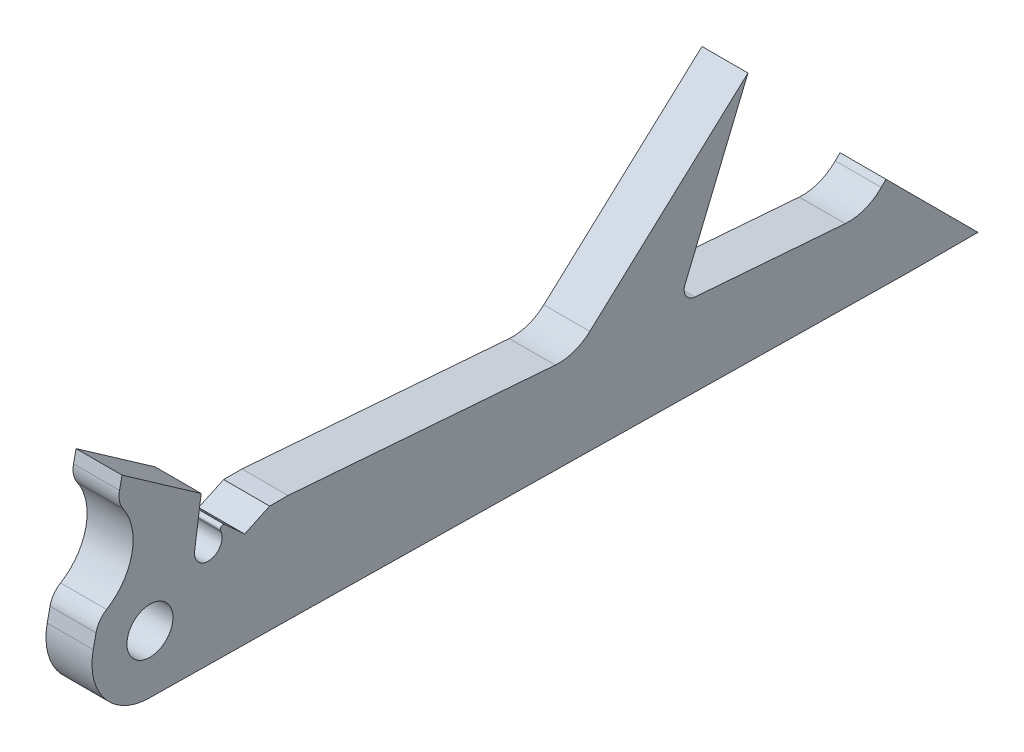
ISO-10303-21;
HEADER;
FILE_DESCRIPTION(('STEP AP214'),'2;1');
FILE_NAME('part.step','',(''),(''),'','','');
FILE_SCHEMA(('AUTOMOTIVE_DESIGN { 1 0 10303 214 1 1 1 1 }'));
ENDSEC;
DATA;
#1=APPLICATION_CONTEXT('core data for automotive mechanical design processes');
#2=APPLICATION_PROTOCOL_DEFINITION('international standard','automotive_design',2000,#1);
#3=PRODUCT_CONTEXT('',#1,'mechanical');
#4=PRODUCT('Part','Part','',(#3));
#5=PRODUCT_RELATED_PRODUCT_CATEGORY('part','',(#4));
#6=PRODUCT_DEFINITION_FORMATION('','',#4);
#7=PRODUCT_DEFINITION_CONTEXT('part definition',#1,'design');
#8=PRODUCT_DEFINITION('design','',#6,#7);
#9=PRODUCT_DEFINITION_SHAPE('','',#8);
#10=(LENGTH_UNIT() NAMED_UNIT(*) SI_UNIT(.MILLI.,.METRE.));
#11=(NAMED_UNIT(*) PLANE_ANGLE_UNIT() SI_UNIT($,.RADIAN.));
#12=(NAMED_UNIT(*) SI_UNIT($,.STERADIAN.) SOLID_ANGLE_UNIT());
#13=UNCERTAINTY_MEASURE_WITH_UNIT(LENGTH_MEASURE(1.E-05),#10,'distance_accuracy_value','');
#14=(GEOMETRIC_REPRESENTATION_CONTEXT(3) GLOBAL_UNCERTAINTY_ASSIGNED_CONTEXT((#13)) GLOBAL_UNIT_ASSIGNED_CONTEXT((#10,
#11,#12)) REPRESENTATION_CONTEXT('',''));
#15=CARTESIAN_POINT('',(0.,0.,0.));
#16=DIRECTION('',(0.,0.,1.));
#17=DIRECTION('',(1.,0.,0.));
#18=AXIS2_PLACEMENT_3D('',#15,#16,#17);
#19=CARTESIAN_POINT('',(-102.961958676435,16.1650258056597,-195.52164647412));
#20=DIRECTION('',(0.,0.997013615660703,-0.0772259683472603));
#21=DIRECTION('',(0.,0.0772259683472603,0.997013615660703));
#22=AXIS2_PLACEMENT_3D('',#19,#20,#21);
#23=PLANE('',#22);
#24=DIRECTION('',(0.,0.0772259683472603,0.997013615660703));
#25=VECTOR('',#24,1.);
#26=CARTESIAN_POINT('',(6.35,16.1650258056597,-195.52164647412));
#27=LINE('',#26,#25);
#28=CARTESIAN_POINT('',(6.35,13.3075235044553,-232.412976709976));
#29=VERTEX_POINT('',#28);
#30=CARTESIAN_POINT('',(6.35,16.1650258056597,-195.52164647412));
#31=VERTEX_POINT('',#30);
#32=EDGE_CURVE('E305',#29,#31,#27,.T.);
#33=ORIENTED_EDGE('',*,*,#32,.F.);
#34=DIRECTION('',(1.,0.,0.));
#35=VECTOR('',#34,1.);
#36=CARTESIAN_POINT('',(0.,13.3075235044553,-232.412976709976));
#37=LINE('',#36,#35);
#38=CARTESIAN_POINT('',(0.,13.3075235044553,-232.412976709976));
#39=VERTEX_POINT('',#38);
#40=EDGE_CURVE('E397',#29,#39,#37,.F.);
#41=ORIENTED_EDGE('',*,*,#40,.T.);
#42=DIRECTION('',(0.,-0.0772259683472603,-0.997013615660703));
#43=VECTOR('',#42,1.);
#44=CARTESIAN_POINT('',(0.,16.1650258056597,-195.52164647412));
#45=LINE('',#44,#43);
#46=CARTESIAN_POINT('',(0.,16.1650258056597,-195.52164647412));
#47=VERTEX_POINT('',#46);
#48=EDGE_CURVE('E250',#47,#39,#45,.T.);
#49=ORIENTED_EDGE('',*,*,#48,.F.);
#50=DIRECTION('',(-1.,0.,0.));
#51=VECTOR('',#50,1.);
#52=CARTESIAN_POINT('',(6.35,16.1650258056597,-195.52164647412));
#53=LINE('',#52,#51);
#54=EDGE_CURVE('E363',#31,#47,#53,.T.);
#55=ORIENTED_EDGE('',*,*,#54,.F.);
#56=EDGE_LOOP('',(#33,#41,#49,#55));
#57=FACE_BOUND('',#56,.T.);
#58=ADVANCED_FACE('F41',(#57),#23,.T.);
#59=CARTESIAN_POINT('',(6.35,11.1751250606039,-168.642656227328));
#60=DIRECTION('',(0.,-0.206239852593916,-0.9785014681655));
#61=DIRECTION('',(0.,0.9785014681655,-0.206239852593917));
#62=AXIS2_PLACEMENT_3D('',#59,#60,#61);
#63=PLANE('',#62);
#64=DIRECTION('',(-1.,0.,0.));
#65=VECTOR('',#64,1.);
#66=CARTESIAN_POINT('',(6.35,30.050618874137,-172.621065241919));
#67=LINE('',#66,#65);
#68=CARTESIAN_POINT('',(6.35,30.050618874137,-172.621065241919));
#69=VERTEX_POINT('',#68);
#70=CARTESIAN_POINT('',(0.,30.050618874137,-172.621065241919));
#71=VERTEX_POINT('',#70);
#72=EDGE_CURVE('E345',#69,#71,#67,.T.);
#73=ORIENTED_EDGE('',*,*,#72,.T.);
#74=DIRECTION('',(0.,-0.9785014681655,0.206239852593917));
#75=VECTOR('',#74,1.);
#76=CARTESIAN_POINT('',(0.,11.1751250606039,-168.642656227328));
#77=LINE('',#76,#75);
#78=CARTESIAN_POINT('',(0.,28.4075243340542,-172.274748361701));
#79=VERTEX_POINT('',#78);
#80=EDGE_CURVE('E282',#71,#79,#77,.T.);
#81=ORIENTED_EDGE('',*,*,#80,.T.);
#82=DIRECTION('',(1.,0.,0.));
#83=VECTOR('',#82,1.);
#84=CARTESIAN_POINT('',(6.35,28.4075243340542,-172.274748361701));
#85=LINE('',#84,#83);
#86=CARTESIAN_POINT('',(6.35,28.4075243340542,-172.274748361701));
#87=VERTEX_POINT('',#86);
#88=EDGE_CURVE('E391',#79,#87,#85,.T.);
#89=ORIENTED_EDGE('',*,*,#88,.T.);
#90=DIRECTION('',(0.,-0.9785014681655,0.206239852593916));
#91=VECTOR('',#90,1.);
#92=CARTESIAN_POINT('',(6.35,11.1751250606039,-168.642656227328));
#93=LINE('',#92,#91);
#94=EDGE_CURVE('E339',#69,#87,#93,.T.);
#95=ORIENTED_EDGE('',*,*,#94,.F.);
#96=EDGE_LOOP('',(#73,#81,#89,#95));
#97=FACE_BOUND('',#96,.T.);
#98=ADVANCED_FACE('F475',(#97),#63,.F.);
#99=CARTESIAN_POINT('',(6.35,9.525,-176.47164647412));
#100=DIRECTION('',(1.,0.,0.));
#101=DIRECTION('',(0.,0.,-1.));
#102=AXIS2_PLACEMENT_3D('',#99,#100,#101);
#103=PLANE('',#102);
#104=CARTESIAN_POINT('',(6.35,21.5738272107236,-166.529745054064));
#105=DIRECTION('',(1.,0.,0.));
#106=DIRECTION('',(0.,0.,-1.));
#107=AXIS2_PLACEMENT_3D('',#104,#105,#106);
#108=CIRCLE('',#107,7.61999999999998);
#109=CARTESIAN_POINT('',(6.35,15.0614131048564,-170.486114919698));
#110=VERTEX_POINT('',#109);
#111=CARTESIAN_POINT('',(6.35,25.9353935104965,-172.778035973402));
#112=VERTEX_POINT('',#111);
#113=EDGE_CURVE('E311',#110,#112,#108,.T.);
#114=ORIENTED_EDGE('',*,*,#113,.F.);
#115=CARTESIAN_POINT('',(6.34999999999999,12.3479072274118,-172.134602363713));
#116=DIRECTION('',(1.,0.,0.));
#117=DIRECTION('',(0.,0.,-1.));
#118=AXIS2_PLACEMENT_3D('',#115,#116,#117);
#119=CIRCLE('',#118,3.175);
#120=CARTESIAN_POINT('',(6.35,13.0027187593975,-169.027860202287));
#121=VERTEX_POINT('',#120);
#122=EDGE_CURVE('E389',#110,#121,#119,.T.);
#123=ORIENTED_EDGE('',*,*,#122,.T.);
#124=CARTESIAN_POINT('',(6.35,11.1751250606039,-168.642656227328));
#125=VERTEX_POINT('',#124);
#126=EDGE_CURVE('E338',#121,#125,#93,.T.);
#127=ORIENTED_EDGE('',*,*,#126,.T.);
#128=CARTESIAN_POINT('',(6.35,9.525,-176.47164647412));
#129=DIRECTION('',(1.,0.,0.));
#130=DIRECTION('',(0.,0.,-1.));
#131=AXIS2_PLACEMENT_3D('',#128,#129,#130);
#132=CIRCLE('',#131,8.00100000000005);
#133=CARTESIAN_POINT('',(6.35,1.52470715135464,-176.365272906379));
#134=VERTEX_POINT('',#133);
#135=EDGE_CURVE('E318',#125,#134,#132,.T.);
#136=ORIENTED_EDGE('',*,*,#135,.T.);
#137=DIRECTION('',(0.,-0.0132950340883751,-0.999911617128528));
#138=VECTOR('',#137,1.);
#139=CARTESIAN_POINT('',(6.35,1.27000000001228,-195.521646474134));
#140=LINE('',#139,#138);
#141=CARTESIAN_POINT('',(6.35,1.27000000001228,-195.521646474134));
#142=VERTEX_POINT('',#141);
#143=EDGE_CURVE('E321',#134,#142,#140,.T.);
#144=ORIENTED_EDGE('',*,*,#143,.T.);
#145=DIRECTION('',(0.,-0.0148131893139548,-0.999890278691792));
#146=VECTOR('',#145,1.);
#147=CARTESIAN_POINT('',(6.35,1.27000000001228,-195.521646474134));
#148=LINE('',#147,#146);
#149=CARTESIAN_POINT('',(6.35,1.22755538373154E-11,-281.24664647412));
#150=VERTEX_POINT('',#149);
#151=EDGE_CURVE('E297',#142,#150,#148,.T.);
#152=ORIENTED_EDGE('',*,*,#151,.T.);
#153=DIRECTION('',(0.,0.,-1.));
#154=VECTOR('',#153,1.);
#155=CARTESIAN_POINT('',(6.35,1.22755538373154E-11,-281.24664647412));
#156=LINE('',#155,#154);
#157=CARTESIAN_POINT('',(6.35,1.22755538373154E-11,-290.77164647412));
#158=VERTEX_POINT('',#157);
#159=EDGE_CURVE('E300',#150,#158,#156,.T.);
#160=ORIENTED_EDGE('',*,*,#159,.T.);
#161=DIRECTION('',(0.,0.707106781186547,0.707106781186548));
#162=VECTOR('',#161,1.);
#163=CARTESIAN_POINT('',(6.35,9.52500000001227,-281.24664647412));
#164=LINE('',#163,#162);
#165=CARTESIAN_POINT('',(6.35,12.7000000000123,-278.071646474121));
#166=VERTEX_POINT('',#165);
#167=EDGE_CURVE('E303',#158,#166,#164,.T.);
#168=ORIENTED_EDGE('',*,*,#167,.T.);
#169=DIRECTION('',(0.,-0.707106781186546,0.707106781186549));
#170=VECTOR('',#169,1.);
#171=CARTESIAN_POINT('',(6.35,12.7000000000123,-278.071646474121));
#172=LINE('',#171,#170);
#173=CARTESIAN_POINT('',(6.35,12.0481062180474,-277.419752692156));
#174=VERTEX_POINT('',#173);
#175=EDGE_CURVE('E236',#166,#174,#172,.T.);
#176=ORIENTED_EDGE('',*,*,#175,.T.);
#177=CARTESIAN_POINT('',(6.35,16.5382342785819,-272.929624631621));
#178=DIRECTION('',(1.,0.,0.));
#179=DIRECTION('',(0.,0.,-1.));
#180=AXIS2_PLACEMENT_3D('',#177,#178,#179);
#181=CIRCLE('',#180,6.35);
#182=CARTESIAN_POINT('',(6.35,10.2071978191365,-272.439239732616));
#183=VERTEX_POINT('',#182);
#184=EDGE_CURVE('E408',#174,#183,#181,.F.);
#185=ORIENTED_EDGE('',*,*,#184,.T.);
#186=CARTESIAN_POINT('',(6.35,11.8151602206778,-251.679896183846));
#187=VERTEX_POINT('',#186);
#188=EDGE_CURVE('E306',#183,#187,#27,.T.);
#189=ORIENTED_EDGE('',*,*,#188,.T.);
#190=CARTESIAN_POINT('',(6.34999999999999,13.3979193355392,-251.802492408597));
#191=DIRECTION('',(1.,0.,0.));
#192=DIRECTION('',(0.,0.,-1.));
#193=AXIS2_PLACEMENT_3D('',#190,#191,#192);
#194=CIRCLE('',#193,1.5875);
#195=CARTESIAN_POINT('',(6.35,14.006663990073,-250.336345691663));
#196=VERTEX_POINT('',#195);
#197=EDGE_CURVE('E49',#187,#196,#194,.F.);
#198=ORIENTED_EDGE('',*,*,#197,.T.);
#199=DIRECTION('',(0.,0.923556987045084,-0.383461199706316));
#200=VECTOR('',#199,1.);
#201=CARTESIAN_POINT('',(6.35,11.9842688169187,-249.49664647412));
#202=LINE('',#201,#200);
#203=CARTESIAN_POINT('',(6.35,34.925,-259.02164647412));
#204=VERTEX_POINT('',#203);
#205=EDGE_CURVE('E235',#196,#204,#202,.T.);
#206=ORIENTED_EDGE('',*,*,#205,.T.);
#207=DIRECTION('',(0.,-0.674969183466185,0.737845919803716));
#208=VECTOR('',#207,1.);
#209=CARTESIAN_POINT('',(6.35,34.925,-259.02164647412));
#210=LINE('',#209,#208);
#211=CARTESIAN_POINT('',(6.35,14.9532383731472,-237.189415923992));
#212=VERTEX_POINT('',#211);
#213=EDGE_CURVE('E229',#204,#212,#210,.T.);
#214=ORIENTED_EDGE('',*,*,#213,.T.);
#215=CARTESIAN_POINT('',(6.35,19.6385599639008,-232.903361608982));
#216=DIRECTION('',(1.,0.,0.));
#217=DIRECTION('',(0.,0.,-1.));
#218=AXIS2_PLACEMENT_3D('',#215,#216,#217);
#219=CIRCLE('',#218,6.35);
#220=EDGE_CURVE('E405',#212,#29,#219,.F.);
#221=ORIENTED_EDGE('',*,*,#220,.T.);
#222=ORIENTED_EDGE('',*,*,#32,.T.);
#223=DIRECTION('',(0.,0.,1.));
#224=VECTOR('',#223,1.);
#225=CARTESIAN_POINT('',(6.35,16.1650258056597,-192.993410989748));
#226=LINE('',#225,#224);
#227=CARTESIAN_POINT('',(6.35,16.1650258056597,-192.993410989748));
#228=VERTEX_POINT('',#227);
#229=EDGE_CURVE('E323',#31,#228,#226,.T.);
#230=ORIENTED_EDGE('',*,*,#229,.T.);
#231=DIRECTION('',(0.,-0.422618261740696,0.906307787036652));
#232=VECTOR('',#231,1.);
#233=CARTESIAN_POINT('',(6.35,14.823212824633,-190.115883765906));
#234=LINE('',#233,#232);
#235=CARTESIAN_POINT('',(6.35,14.5548502284277,-189.540378321138));
#236=VERTEX_POINT('',#235);
#237=EDGE_CURVE('E325',#228,#236,#234,.T.);
#238=ORIENTED_EDGE('',*,*,#237,.T.);
#239=DIRECTION('',(0.,0.676997797335805,0.735985042240988));
#240=VECTOR('',#239,1.);
#241=CARTESIAN_POINT('',(6.35,14.5548502284277,-189.540378321138));
#242=LINE('',#241,#240);
#243=CARTESIAN_POINT('',(6.35,17.0552561559139,-186.822110448772));
#244=VERTEX_POINT('',#243);
#245=EDGE_CURVE('E327',#236,#244,#242,.T.);
#246=ORIENTED_EDGE('',*,*,#245,.T.);
#247=CARTESIAN_POINT('',(6.35,16.77484585482,-186.564174287987));
#248=DIRECTION('',(1.,0.,0.));
#249=DIRECTION('',(0.,0.,-1.));
#250=AXIS2_PLACEMENT_3D('',#247,#248,#249);
#251=CIRCLE('',#250,0.381);
#252=CARTESIAN_POINT('',(6.35,16.6323391307895,-186.210829083398));
#253=VERTEX_POINT('',#252);
#254=EDGE_CURVE('E377',#244,#253,#251,.T.);
#255=ORIENTED_EDGE('',*,*,#254,.T.);
#256=DIRECTION('',(0.,-0.927415235141898,-0.374033396405585));
#257=VECTOR('',#256,1.);
#258=CARTESIAN_POINT('',(6.35,18.1986026295995,-185.579143475994));
#259=LINE('',#258,#257);
#260=CARTESIAN_POINT('',(6.35,16.4318766066543,-186.291677096147));
#261=VERTEX_POINT('',#260);
#262=EDGE_CURVE('E330',#253,#261,#259,.T.);
#263=ORIENTED_EDGE('',*,*,#262,.T.);
#264=CARTESIAN_POINT('',(6.35,15.7193429865016,-184.524951073201));
#265=DIRECTION('',(-1.,0.,0.));
#266=DIRECTION('',(0.,0.,1.));
#267=AXIS2_PLACEMENT_3D('',#264,#265,#266);
#268=CIRCLE('',#267,1.90500000000014);
#269=CARTESIAN_POINT('',(6.35,15.9856337818719,-182.638654645727));
#270=VERTEX_POINT('',#269);
#271=EDGE_CURVE('E332',#261,#270,#268,.T.);
#272=ORIENTED_EDGE('',*,*,#271,.T.);
#273=DIRECTION('',(0.,0.990181851692391,-0.139785194419966));
#274=VECTOR('',#273,1.);
#275=CARTESIAN_POINT('',(6.35,15.9856337818719,-182.638654645727));
#276=LINE('',#275,#274);
#277=CARTESIAN_POINT('',(6.35,22.4019770953957,-183.544457752513));
#278=VERTEX_POINT('',#277);
#279=EDGE_CURVE('E334',#270,#278,#276,.T.);
#280=ORIENTED_EDGE('',*,*,#279,.T.);
#281=DIRECTION('',(0.,0.573576436351046,0.819152044288992));
#282=VECTOR('',#281,1.);
#283=CARTESIAN_POINT('',(6.35,30.050618874137,-172.621065241919));
#284=LINE('',#283,#282);
#285=EDGE_CURVE('E336',#278,#69,#284,.T.);
#286=ORIENTED_EDGE('',*,*,#285,.T.);
#287=ORIENTED_EDGE('',*,*,#94,.T.);
#288=CARTESIAN_POINT('',(6.34999999999999,27.7527128020685,-175.381490523126));
#289=DIRECTION('',(1.,0.,0.));
#290=DIRECTION('',(0.,0.,-1.));
#291=AXIS2_PLACEMENT_3D('',#288,#289,#290);
#292=CIRCLE('',#291,3.175);
#293=EDGE_CURVE('E387',#87,#112,#292,.T.);
#294=ORIENTED_EDGE('',*,*,#293,.T.);
#295=EDGE_LOOP('',(#114,#123,#127,#136,#144,#152,#160,#168,#176,#185,#189,#198,#206,#214,#221,
#222,#230,#238,#246,#255,#263,#272,#280,#286,#287,#294));
#296=FACE_BOUND('',#295,.T.);
#297=CARTESIAN_POINT('',(6.35,9.525,-176.47164647412));
#298=DIRECTION('',(1.,0.,0.));
#299=DIRECTION('',(0.,0.,-1.));
#300=AXIS2_PLACEMENT_3D('',#297,#298,#299);
#301=CIRCLE('',#300,3.17499999999995);
#302=CARTESIAN_POINT('',(6.35,9.525,-179.64664647412));
#303=VERTEX_POINT('',#302);
#304=EDGE_CURVE('E315',#303,#303,#301,.T.);
#305=ORIENTED_EDGE('',*,*,#304,.F.);
#306=EDGE_LOOP('',(#305));
#307=FACE_BOUND('',#306,.T.);
#308=ADVANCED_FACE('F423',(#296,#307),#103,.T.);
#309=CARTESIAN_POINT('',(6.35,9.525,-176.47164647412));
#310=DIRECTION('',(-1.,0.,0.));
#311=DIRECTION('',(0.,0.,1.));
#312=AXIS2_PLACEMENT_3D('',#309,#310,#311);
#313=CYLINDRICAL_SURFACE('',#312,8.00100000000005);
#314=DIRECTION('',(-1.,0.,0.));
#315=VECTOR('',#314,1.);
#316=CARTESIAN_POINT('',(6.35,11.1751250606039,-168.642656227328));
#317=LINE('',#316,#315);
#318=CARTESIAN_POINT('',(0.,11.1751250606039,-168.642656227328));
#319=VERTEX_POINT('',#318);
#320=EDGE_CURVE('E342',#125,#319,#317,.T.);
#321=ORIENTED_EDGE('',*,*,#320,.T.);
#322=CARTESIAN_POINT('',(0.,9.525,-176.47164647412));
#323=DIRECTION('',(1.,0.,0.));
#324=DIRECTION('',(0.,0.,-1.));
#325=AXIS2_PLACEMENT_3D('',#322,#323,#324);
#326=CIRCLE('',#325,8.00100000000005);
#327=CARTESIAN_POINT('',(0.,1.52470715135464,-176.365272906379));
#328=VERTEX_POINT('',#327);
#329=EDGE_CURVE('E258',#319,#328,#326,.T.);
#330=ORIENTED_EDGE('',*,*,#329,.T.);
#331=DIRECTION('',(-1.,0.,0.));
#332=VECTOR('',#331,1.);
#333=CARTESIAN_POINT('',(6.35,1.52470715135464,-176.365272906379));
#334=LINE('',#333,#332);
#335=EDGE_CURVE('E369',#134,#328,#334,.T.);
#336=ORIENTED_EDGE('',*,*,#335,.F.);
#337=ORIENTED_EDGE('',*,*,#135,.F.);
#338=EDGE_LOOP('',(#321,#330,#336,#337));
#339=FACE_BOUND('',#338,.T.);
#340=ADVANCED_FACE('F453',(#339),#313,.T.);
#341=CARTESIAN_POINT('',(6.35,1.27000000001228,-195.521646474134));
#342=DIRECTION('',(0.,0.999911617128528,-0.0132950340883751));
#343=DIRECTION('',(0.,0.0132950340883751,0.999911617128528));
#344=AXIS2_PLACEMENT_3D('',#341,#342,#343);
#345=PLANE('',#344);
#346=ORIENTED_EDGE('',*,*,#335,.T.);
#347=DIRECTION('',(0.,-0.0132950340883751,-0.999911617128528));
#348=VECTOR('',#347,1.);
#349=CARTESIAN_POINT('',(0.,1.27000000001228,-195.521646474134));
#350=LINE('',#349,#348);
#351=CARTESIAN_POINT('',(0.,1.27000000001228,-195.521646474134));
#352=VERTEX_POINT('',#351);
#353=EDGE_CURVE('E255',#328,#352,#350,.T.);
#354=ORIENTED_EDGE('',*,*,#353,.T.);
#355=DIRECTION('',(-1.,0.,0.));
#356=VECTOR('',#355,1.);
#357=CARTESIAN_POINT('',(6.35,1.27000000001228,-195.521646474134));
#358=LINE('',#357,#356);
#359=EDGE_CURVE('E366',#142,#352,#358,.T.);
#360=ORIENTED_EDGE('',*,*,#359,.F.);
#361=ORIENTED_EDGE('',*,*,#143,.F.);
#362=EDGE_LOOP('',(#346,#354,#360,#361));
#363=FACE_BOUND('',#362,.T.);
#364=ADVANCED_FACE('F450',(#363),#345,.F.);
#365=CARTESIAN_POINT('',(6.35,16.1650258056597,-192.993410989748));
#366=DIRECTION('',(0.,-1.,0.));
#367=DIRECTION('',(0.,0.,-1.));
#368=AXIS2_PLACEMENT_3D('',#365,#366,#367);
#369=PLANE('',#368);
#370=ORIENTED_EDGE('',*,*,#54,.T.);
#371=DIRECTION('',(0.,0.,1.));
#372=VECTOR('',#371,1.);
#373=CARTESIAN_POINT('',(0.,16.1650258056597,-192.993410989748));
#374=LINE('',#373,#372);
#375=CARTESIAN_POINT('',(0.,16.1650258056597,-192.993410989748));
#376=VERTEX_POINT('',#375);
#377=EDGE_CURVE('E252',#47,#376,#374,.T.);
#378=ORIENTED_EDGE('',*,*,#377,.T.);
#379=DIRECTION('',(-1.,0.,0.));
#380=VECTOR('',#379,1.);
#381=CARTESIAN_POINT('',(6.35,16.1650258056597,-192.993410989748));
#382=LINE('',#381,#380);
#383=EDGE_CURVE('E360',#228,#376,#382,.T.);
#384=ORIENTED_EDGE('',*,*,#383,.F.);
#385=ORIENTED_EDGE('',*,*,#229,.F.);
#386=EDGE_LOOP('',(#370,#378,#384,#385));
#387=FACE_BOUND('',#386,.T.);
#388=ADVANCED_FACE('F508',(#387),#369,.F.);
#389=CARTESIAN_POINT('',(6.35,14.5548502284277,-189.540378321138));
#390=DIRECTION('',(0.,-0.906307787036652,-0.422618261740695));
#391=DIRECTION('',(0.,0.422618261740695,-0.906307787036652));
#392=AXIS2_PLACEMENT_3D('',#389,#390,#391);
#393=PLANE('',#392);
#394=ORIENTED_EDGE('',*,*,#383,.T.);
#395=DIRECTION('',(0.,-0.422618261740695,0.906307787036652));
#396=VECTOR('',#395,1.);
#397=CARTESIAN_POINT('',(0.,14.5548502284277,-189.540378321138));
#398=LINE('',#397,#396);
#399=CARTESIAN_POINT('',(0.,14.5548502284277,-189.540378321138));
#400=VERTEX_POINT('',#399);
#401=EDGE_CURVE('E264',#376,#400,#398,.T.);
#402=ORIENTED_EDGE('',*,*,#401,.T.);
#403=DIRECTION('',(-1.,0.,0.));
#404=VECTOR('',#403,1.);
#405=CARTESIAN_POINT('',(6.35,14.5548502284277,-189.540378321138));
#406=LINE('',#405,#404);
#407=EDGE_CURVE('E357',#236,#400,#406,.T.);
#408=ORIENTED_EDGE('',*,*,#407,.F.);
#409=ORIENTED_EDGE('',*,*,#237,.F.);
#410=EDGE_LOOP('',(#394,#402,#408,#409));
#411=FACE_BOUND('',#410,.T.);
#412=ADVANCED_FACE('F504',(#411),#393,.F.);
#413=CARTESIAN_POINT('',(6.35,14.5548502284277,-189.540378321138));
#414=DIRECTION('',(0.,-0.735985042240988,0.676997797335804));
#415=DIRECTION('',(0.,-0.676997797335804,-0.735985042240988));
#416=AXIS2_PLACEMENT_3D('',#413,#414,#415);
#417=PLANE('',#416);
#418=ORIENTED_EDGE('',*,*,#407,.T.);
#419=DIRECTION('',(0.,0.676997797335804,0.735985042240988));
#420=VECTOR('',#419,1.);
#421=CARTESIAN_POINT('',(0.,14.5548502284277,-189.540378321138));
#422=LINE('',#421,#420);
#423=CARTESIAN_POINT('',(0.,17.0552561559139,-186.822110448772));
#424=VERTEX_POINT('',#423);
#425=EDGE_CURVE('E272',#400,#424,#422,.T.);
#426=ORIENTED_EDGE('',*,*,#425,.T.);
#427=DIRECTION('',(-1.,0.,0.));
#428=VECTOR('',#427,1.);
#429=CARTESIAN_POINT('',(6.35,17.0552561559139,-186.822110448772));
#430=LINE('',#429,#428);
#431=EDGE_CURVE('E375',#424,#244,#430,.F.);
#432=ORIENTED_EDGE('',*,*,#431,.T.);
#433=ORIENTED_EDGE('',*,*,#245,.F.);
#434=EDGE_LOOP('',(#418,#426,#432,#433));
#435=FACE_BOUND('',#434,.T.);
#436=ADVANCED_FACE('F499',(#435),#417,.F.);
#437=CARTESIAN_POINT('',(6.35,18.1986026295995,-185.579143475994));
#438=DIRECTION('',(0.,0.374033396405585,-0.927415235141898));
#439=DIRECTION('',(0.,0.927415235141898,0.374033396405585));
#440=AXIS2_PLACEMENT_3D('',#437,#438,#439);
#441=PLANE('',#440);
#442=DIRECTION('',(-1.,0.,0.));
#443=VECTOR('',#442,1.);
#444=CARTESIAN_POINT('',(6.35,16.6323391307895,-186.210829083398));
#445=LINE('',#444,#443);
#446=CARTESIAN_POINT('',(0.,16.6323391307895,-186.210829083398));
#447=VERTEX_POINT('',#446);
#448=EDGE_CURVE('E372',#253,#447,#445,.T.);
#449=ORIENTED_EDGE('',*,*,#448,.T.);
#450=DIRECTION('',(0.,-0.927415235141898,-0.374033396405585));
#451=VECTOR('',#450,1.);
#452=CARTESIAN_POINT('',(0.,18.1986026295995,-185.579143475994));
#453=LINE('',#452,#451);
#454=CARTESIAN_POINT('',(0.,16.4318766066543,-186.291677096147));
#455=VERTEX_POINT('',#454);
#456=EDGE_CURVE('E279',#447,#455,#453,.T.);
#457=ORIENTED_EDGE('',*,*,#456,.T.);
#458=DIRECTION('',(-1.,0.,0.));
#459=VECTOR('',#458,1.);
#460=CARTESIAN_POINT('',(6.35,16.4318766066543,-186.291677096147));
#461=LINE('',#460,#459);
#462=EDGE_CURVE('E354',#261,#455,#461,.T.);
#463=ORIENTED_EDGE('',*,*,#462,.F.);
#464=ORIENTED_EDGE('',*,*,#262,.F.);
#465=EDGE_LOOP('',(#449,#457,#463,#464));
#466=FACE_BOUND('',#465,.T.);
#467=ADVANCED_FACE('F491',(#466),#441,.F.);
#468=CARTESIAN_POINT('',(6.35,15.7193429865016,-184.524951073201));
#469=DIRECTION('',(-1.,0.,0.));
#470=DIRECTION('',(0.,0.,1.));
#471=AXIS2_PLACEMENT_3D('',#468,#469,#470);
#472=CYLINDRICAL_SURFACE('',#471,1.90500000000014);
#473=ORIENTED_EDGE('',*,*,#462,.T.);
#474=CARTESIAN_POINT('',(0.,15.7193429865016,-184.524951073201));
#475=DIRECTION('',(1.,0.,0.));
#476=DIRECTION('',(0.,0.,-1.));
#477=AXIS2_PLACEMENT_3D('',#474,#475,#476);
#478=CIRCLE('',#477,1.90500000000014);
#479=CARTESIAN_POINT('',(0.,15.9856337818719,-182.638654645727));
#480=VERTEX_POINT('',#479);
#481=EDGE_CURVE('E291',#455,#480,#478,.F.);
#482=ORIENTED_EDGE('',*,*,#481,.T.);
#483=DIRECTION('',(-1.,0.,0.));
#484=VECTOR('',#483,1.);
#485=CARTESIAN_POINT('',(6.35,15.9856337818719,-182.638654645727));
#486=LINE('',#485,#484);
#487=EDGE_CURVE('E351',#270,#480,#486,.T.);
#488=ORIENTED_EDGE('',*,*,#487,.F.);
#489=ORIENTED_EDGE('',*,*,#271,.F.);
#490=EDGE_LOOP('',(#473,#482,#488,#489));
#491=FACE_BOUND('',#490,.T.);
#492=ADVANCED_FACE('F487',(#491),#472,.F.);
#493=CARTESIAN_POINT('',(6.35,15.9856337818719,-182.638654645727));
#494=DIRECTION('',(0.,0.139785194419966,0.990181851692391));
#495=DIRECTION('',(0.,-0.990181851692391,0.139785194419966));
#496=AXIS2_PLACEMENT_3D('',#493,#494,#495);
#497=PLANE('',#496);
#498=ORIENTED_EDGE('',*,*,#487,.T.);
#499=DIRECTION('',(0.,0.990181851692391,-0.139785194419966));
#500=VECTOR('',#499,1.);
#501=CARTESIAN_POINT('',(0.,15.9856337818719,-182.638654645727));
#502=LINE('',#501,#500);
#503=CARTESIAN_POINT('',(0.,22.4019770953957,-183.544457752513));
#504=VERTEX_POINT('',#503);
#505=EDGE_CURVE('E288',#480,#504,#502,.T.);
#506=ORIENTED_EDGE('',*,*,#505,.T.);
#507=DIRECTION('',(-1.,0.,0.));
#508=VECTOR('',#507,1.);
#509=CARTESIAN_POINT('',(6.35,22.4019770953957,-183.544457752513));
#510=LINE('',#509,#508);
#511=EDGE_CURVE('E348',#278,#504,#510,.T.);
#512=ORIENTED_EDGE('',*,*,#511,.F.);
#513=ORIENTED_EDGE('',*,*,#279,.F.);
#514=EDGE_LOOP('',(#498,#506,#512,#513));
#515=FACE_BOUND('',#514,.T.);
#516=ADVANCED_FACE('F482',(#515),#497,.F.);
#517=CARTESIAN_POINT('',(6.35,30.050618874137,-172.621065241919));
#518=DIRECTION('',(0.,-0.819152044288992,0.573576436351046));
#519=DIRECTION('',(0.,-0.573576436351046,-0.819152044288992));
#520=AXIS2_PLACEMENT_3D('',#517,#518,#519);
#521=PLANE('',#520);
#522=ORIENTED_EDGE('',*,*,#511,.T.);
#523=DIRECTION('',(0.,0.573576436351046,0.819152044288992));
#524=VECTOR('',#523,1.);
#525=CARTESIAN_POINT('',(0.,30.050618874137,-172.621065241919));
#526=LINE('',#525,#524);
#527=EDGE_CURVE('E285',#504,#71,#526,.T.);
#528=ORIENTED_EDGE('',*,*,#527,.T.);
#529=ORIENTED_EDGE('',*,*,#72,.F.);
#530=ORIENTED_EDGE('',*,*,#285,.F.);
#531=EDGE_LOOP('',(#522,#528,#529,#530));
#532=FACE_BOUND('',#531,.T.);
#533=ADVANCED_FACE('F479',(#532),#521,.F.);
#534=DIRECTION('',(1.,0.,0.));
#535=VECTOR('',#534,1.);
#536=CARTESIAN_POINT('',(6.35,13.0027187593975,-169.027860202287));
#537=LINE('',#536,#535);
#538=CARTESIAN_POINT('',(0.,13.0027187593975,-169.027860202287));
#539=VERTEX_POINT('',#538);
#540=EDGE_CURVE('E379',#121,#539,#537,.F.);
#541=ORIENTED_EDGE('',*,*,#540,.T.);
#542=DIRECTION('',(0.,-0.9785014681655,0.206239852593917));
#543=VECTOR('',#542,1.);
#544=CARTESIAN_POINT('',(0.,11.1751250606039,-168.642656227328));
#545=LINE('',#544,#543);
#546=EDGE_CURVE('E261',#539,#319,#545,.T.);
#547=ORIENTED_EDGE('',*,*,#546,.T.);
#548=ORIENTED_EDGE('',*,*,#320,.F.);
#549=ORIENTED_EDGE('',*,*,#126,.F.);
#550=EDGE_LOOP('',(#541,#547,#548,#549));
#551=FACE_BOUND('',#550,.T.);
#552=ADVANCED_FACE('F458',(#551),#63,.F.);
#553=CARTESIAN_POINT('',(6.35,9.525,-176.47164647412));
#554=DIRECTION('',(-1.,0.,0.));
#555=DIRECTION('',(0.,0.,1.));
#556=AXIS2_PLACEMENT_3D('',#553,#554,#555);
#557=CYLINDRICAL_SURFACE('',#556,3.17499999999995);
#558=CARTESIAN_POINT('',(0.,9.525,-176.47164647412));
#559=DIRECTION('',(1.,0.,0.));
#560=DIRECTION('',(0.,0.,-1.));
#561=AXIS2_PLACEMENT_3D('',#558,#559,#560);
#562=CIRCLE('',#561,3.17499999999995);
#563=CARTESIAN_POINT('',(0.,9.525,-179.64664647412));
#564=VERTEX_POINT('',#563);
#565=EDGE_CURVE('E294',#564,#564,#562,.T.);
#566=ORIENTED_EDGE('',*,*,#565,.F.);
#567=EDGE_LOOP('',(#566));
#568=FACE_BOUND('',#567,.T.);
#569=ORIENTED_EDGE('',*,*,#304,.T.);
#570=EDGE_LOOP('',(#569));
#571=FACE_BOUND('',#570,.T.);
#572=ADVANCED_FACE('F559',(#568,#571),#557,.F.);
#573=CARTESIAN_POINT('',(6.35,16.77484585482,-186.564174287987));
#574=DIRECTION('',(-1.,0.,0.));
#575=DIRECTION('',(0.,0.,1.));
#576=AXIS2_PLACEMENT_3D('',#573,#574,#575);
#577=CYLINDRICAL_SURFACE('',#576,0.381);
#578=CARTESIAN_POINT('',(0.,16.77484585482,-186.564174287987));
#579=DIRECTION('',(1.,0.,0.));
#580=DIRECTION('',(0.,0.,-1.));
#581=AXIS2_PLACEMENT_3D('',#578,#579,#580);
#582=CIRCLE('',#581,0.381);
#583=EDGE_CURVE('E277',#447,#424,#582,.F.);
#584=ORIENTED_EDGE('',*,*,#583,.F.);
#585=ORIENTED_EDGE('',*,*,#448,.F.);
#586=ORIENTED_EDGE('',*,*,#254,.F.);
#587=ORIENTED_EDGE('',*,*,#431,.F.);
#588=EDGE_LOOP('',(#584,#585,#586,#587));
#589=FACE_BOUND('',#588,.T.);
#590=ADVANCED_FACE('F496',(#589),#577,.T.);
#591=CARTESIAN_POINT('',(-184.148396423742,21.5738272107236,-166.529745054064));
#592=DIRECTION('',(1.,0.,0.));
#593=DIRECTION('',(0.,0.,-1.));
#594=AXIS2_PLACEMENT_3D('',#591,#592,#593);
#595=CYLINDRICAL_SURFACE('',#594,7.61999999999998);
#596=DIRECTION('',(1.,0.,0.));
#597=VECTOR('',#596,1.);
#598=CARTESIAN_POINT('',(-184.148396423742,25.9353935104965,-172.778035973402));
#599=LINE('',#598,#597);
#600=CARTESIAN_POINT('',(0.,25.9353935104965,-172.778035973402));
#601=VERTEX_POINT('',#600);
#602=EDGE_CURVE('E382',#112,#601,#599,.F.);
#603=ORIENTED_EDGE('',*,*,#602,.T.);
#604=CARTESIAN_POINT('',(0.,21.5738272107236,-166.529745054064));
#605=DIRECTION('',(1.,0.,0.));
#606=DIRECTION('',(0.,0.,-1.));
#607=AXIS2_PLACEMENT_3D('',#604,#605,#606);
#608=CIRCLE('',#607,7.61999999999998);
#609=CARTESIAN_POINT('',(0.,15.0614131048564,-170.486114919698));
#610=VERTEX_POINT('',#609);
#611=EDGE_CURVE('E269',#601,#610,#608,.F.);
#612=ORIENTED_EDGE('',*,*,#611,.T.);
#613=DIRECTION('',(1.,0.,0.));
#614=VECTOR('',#613,1.);
#615=CARTESIAN_POINT('',(-184.148396423742,15.0614131048564,-170.486114919698));
#616=LINE('',#615,#614);
#617=EDGE_CURVE('E385',#610,#110,#616,.T.);
#618=ORIENTED_EDGE('',*,*,#617,.T.);
#619=ORIENTED_EDGE('',*,*,#113,.T.);
#620=EDGE_LOOP('',(#603,#612,#618,#619));
#621=FACE_BOUND('',#620,.T.);
#622=ADVANCED_FACE('F466',(#621),#595,.F.);
#623=CARTESIAN_POINT('',(-184.148396423742,12.3479072274118,-172.134602363713));
#624=DIRECTION('',(1.,0.,0.));
#625=DIRECTION('',(0.,0.,-1.));
#626=AXIS2_PLACEMENT_3D('',#623,#624,#625);
#627=CYLINDRICAL_SURFACE('',#626,3.175);
#628=CARTESIAN_POINT('',(0.,12.3479072274118,-172.134602363713));
#629=DIRECTION('',(1.,0.,0.));
#630=DIRECTION('',(0.,0.,-1.));
#631=AXIS2_PLACEMENT_3D('',#628,#629,#630);
#632=CIRCLE('',#631,3.175);
#633=EDGE_CURVE('E267',#539,#610,#632,.F.);
#634=ORIENTED_EDGE('',*,*,#633,.F.);
#635=ORIENTED_EDGE('',*,*,#540,.F.);
#636=ORIENTED_EDGE('',*,*,#122,.F.);
#637=ORIENTED_EDGE('',*,*,#617,.F.);
#638=EDGE_LOOP('',(#634,#635,#636,#637));
#639=FACE_BOUND('',#638,.T.);
#640=ADVANCED_FACE('F463',(#639),#627,.T.);
#641=CARTESIAN_POINT('',(-184.148396423742,27.7527128020685,-175.381490523126));
#642=DIRECTION('',(1.,0.,0.));
#643=DIRECTION('',(0.,0.,-1.));
#644=AXIS2_PLACEMENT_3D('',#641,#642,#643);
#645=CYLINDRICAL_SURFACE('',#644,3.175);
#646=CARTESIAN_POINT('',(0.,27.7527128020685,-175.381490523126));
#647=DIRECTION('',(1.,0.,0.));
#648=DIRECTION('',(0.,0.,-1.));
#649=AXIS2_PLACEMENT_3D('',#646,#647,#648);
#650=CIRCLE('',#649,3.175);
#651=EDGE_CURVE('E275',#601,#79,#650,.F.);
#652=ORIENTED_EDGE('',*,*,#651,.F.);
#653=ORIENTED_EDGE('',*,*,#602,.F.);
#654=ORIENTED_EDGE('',*,*,#293,.F.);
#655=ORIENTED_EDGE('',*,*,#88,.F.);
#656=EDGE_LOOP('',(#652,#653,#654,#655));
#657=FACE_BOUND('',#656,.T.);
#658=ADVANCED_FACE('F473',(#657),#645,.T.);
#659=CARTESIAN_POINT('',(0.,11.8151602206778,-251.679896183846));
#660=VERTEX_POINT('',#659);
#661=CARTESIAN_POINT('',(0.,10.2071978191365,-272.439239732616));
#662=VERTEX_POINT('',#661);
#663=EDGE_CURVE('E249',#660,#662,#45,.T.);
#664=ORIENTED_EDGE('',*,*,#663,.F.);
#665=DIRECTION('',(1.,0.,0.));
#666=VECTOR('',#665,1.);
#667=CARTESIAN_POINT('',(6.34999999999999,11.8151602206778,-251.679896183846));
#668=LINE('',#667,#666);
#669=EDGE_CURVE('E412',#660,#187,#668,.T.);
#670=ORIENTED_EDGE('',*,*,#669,.T.);
#671=ORIENTED_EDGE('',*,*,#188,.F.);
#672=DIRECTION('',(1.,0.,0.));
#673=VECTOR('',#672,1.);
#674=CARTESIAN_POINT('',(0.,10.2071978191365,-272.439239732616));
#675=LINE('',#674,#673);
#676=EDGE_CURVE('E402',#183,#662,#675,.F.);
#677=ORIENTED_EDGE('',*,*,#676,.T.);
#678=EDGE_LOOP('',(#664,#670,#671,#677));
#679=FACE_BOUND('',#678,.T.);
#680=ADVANCED_FACE('F419',(#679),#23,.T.);
#681=CARTESIAN_POINT('',(-102.961958676435,9.52500000001227,-281.24664647412));
#682=DIRECTION('',(0.,0.707106781186548,-0.707106781186547));
#683=DIRECTION('',(0.,0.707106781186547,0.707106781186548));
#684=AXIS2_PLACEMENT_3D('',#681,#682,#683);
#685=PLANE('',#684);
#686=DIRECTION('',(0.,-0.707106781186547,-0.707106781186548));
#687=VECTOR('',#686,1.);
#688=CARTESIAN_POINT('',(0.,9.52500000001227,-281.24664647412));
#689=LINE('',#688,#687);
#690=CARTESIAN_POINT('',(0.,12.7000000000123,-278.071646474121));
#691=VERTEX_POINT('',#690);
#692=CARTESIAN_POINT('',(0.,1.22731685925359E-11,-290.77164647412));
#693=VERTEX_POINT('',#692);
#694=EDGE_CURVE('E247',#691,#693,#689,.T.);
#695=ORIENTED_EDGE('',*,*,#694,.F.);
#696=DIRECTION('',(1.,0.,0.));
#697=VECTOR('',#696,1.);
#698=CARTESIAN_POINT('',(-33.1021491835592,12.7000000000123,-278.071646474121));
#699=LINE('',#698,#697);
#700=EDGE_CURVE('E241',#691,#166,#699,.T.);
#701=ORIENTED_EDGE('',*,*,#700,.T.);
#702=ORIENTED_EDGE('',*,*,#167,.F.);
#703=DIRECTION('',(1.,0.,0.));
#704=VECTOR('',#703,1.);
#705=CARTESIAN_POINT('',(-102.961958676435,1.22755538373154E-11,-290.77164647412));
#706=LINE('',#705,#704);
#707=EDGE_CURVE('E309',#693,#158,#706,.T.);
#708=ORIENTED_EDGE('',*,*,#707,.F.);
#709=EDGE_LOOP('',(#695,#701,#702,#708));
#710=FACE_BOUND('',#709,.T.);
#711=ADVANCED_FACE('F438',(#710),#685,.T.);
#712=CARTESIAN_POINT('',(-102.961958676435,1.22755538373154E-11,-281.24664647412));
#713=DIRECTION('',(0.,-1.,0.));
#714=DIRECTION('',(0.,0.,-1.));
#715=AXIS2_PLACEMENT_3D('',#712,#713,#714);
#716=PLANE('',#715);
#717=DIRECTION('',(0.,0.,1.));
#718=VECTOR('',#717,1.);
#719=CARTESIAN_POINT('',(0.,1.22755538373154E-11,-281.24664647412));
#720=LINE('',#719,#718);
#721=CARTESIAN_POINT('',(0.,1.22755538373154E-11,-281.24664647412));
#722=VERTEX_POINT('',#721);
#723=EDGE_CURVE('E240',#693,#722,#720,.T.);
#724=ORIENTED_EDGE('',*,*,#723,.F.);
#725=ORIENTED_EDGE('',*,*,#707,.T.);
#726=ORIENTED_EDGE('',*,*,#159,.F.);
#727=DIRECTION('',(1.,0.,0.));
#728=VECTOR('',#727,1.);
#729=CARTESIAN_POINT('',(-102.961958676435,1.22755538373154E-11,-281.24664647412));
#730=LINE('',#729,#728);
#731=EDGE_CURVE('E308',#722,#150,#730,.T.);
#732=ORIENTED_EDGE('',*,*,#731,.F.);
#733=EDGE_LOOP('',(#724,#725,#726,#732));
#734=FACE_BOUND('',#733,.T.);
#735=ADVANCED_FACE('F442',(#734),#716,.T.);
#736=CARTESIAN_POINT('',(-102.961958676435,1.27000000001228,-195.521646474134));
#737=DIRECTION('',(0.,-0.999890278691792,0.0148131893139548));
#738=DIRECTION('',(0.,-0.0148131893139548,-0.999890278691792));
#739=AXIS2_PLACEMENT_3D('',#736,#737,#738);
#740=PLANE('',#739);
#741=DIRECTION('',(0.,0.0148131893139548,0.999890278691792));
#742=VECTOR('',#741,1.);
#743=CARTESIAN_POINT('',(0.,1.27000000001228,-195.521646474134));
#744=LINE('',#743,#742);
#745=EDGE_CURVE('E393',#722,#352,#744,.T.);
#746=ORIENTED_EDGE('',*,*,#745,.F.);
#747=ORIENTED_EDGE('',*,*,#731,.T.);
#748=ORIENTED_EDGE('',*,*,#151,.F.);
#749=ORIENTED_EDGE('',*,*,#359,.T.);
#750=EDGE_LOOP('',(#746,#747,#748,#749));
#751=FACE_BOUND('',#750,.T.);
#752=ADVANCED_FACE('F446',(#751),#740,.T.);
#753=CARTESIAN_POINT('',(0.,9.525,-176.47164647412));
#754=DIRECTION('',(1.,0.,0.));
#755=DIRECTION('',(0.,0.,-1.));
#756=AXIS2_PLACEMENT_3D('',#753,#754,#755);
#757=PLANE('',#756);
#758=ORIENTED_EDGE('',*,*,#565,.T.);
#759=EDGE_LOOP('',(#758));
#760=FACE_BOUND('',#759,.T.);
#761=ORIENTED_EDGE('',*,*,#456,.F.);
#762=ORIENTED_EDGE('',*,*,#583,.T.);
#763=ORIENTED_EDGE('',*,*,#425,.F.);
#764=ORIENTED_EDGE('',*,*,#401,.F.);
#765=ORIENTED_EDGE('',*,*,#377,.F.);
#766=ORIENTED_EDGE('',*,*,#48,.T.);
#767=CARTESIAN_POINT('',(0.,19.6385599639008,-232.903361608982));
#768=DIRECTION('',(1.,0.,0.));
#769=DIRECTION('',(0.,0.,-1.));
#770=AXIS2_PLACEMENT_3D('',#767,#768,#769);
#771=CIRCLE('',#770,6.35);
#772=CARTESIAN_POINT('',(0.,14.9532383731472,-237.189415923992));
#773=VERTEX_POINT('',#772);
#774=EDGE_CURVE('E219',#39,#773,#771,.T.);
#775=ORIENTED_EDGE('',*,*,#774,.T.);
#776=DIRECTION('',(0.,0.674969183466185,-0.737845919803716));
#777=VECTOR('',#776,1.);
#778=CARTESIAN_POINT('',(0.,34.925,-259.02164647412));
#779=LINE('',#778,#777);
#780=CARTESIAN_POINT('',(0.,34.925,-259.02164647412));
#781=VERTEX_POINT('',#780);
#782=EDGE_CURVE('E212',#773,#781,#779,.T.);
#783=ORIENTED_EDGE('',*,*,#782,.T.);
#784=DIRECTION('',(0.,-0.923556987045084,0.383461199706316));
#785=VECTOR('',#784,1.);
#786=CARTESIAN_POINT('',(0.,11.9842688169187,-249.49664647412));
#787=LINE('',#786,#785);
#788=CARTESIAN_POINT('',(0.,14.006663990073,-250.336345691663));
#789=VERTEX_POINT('',#788);
#790=EDGE_CURVE('E215',#781,#789,#787,.T.);
#791=ORIENTED_EDGE('',*,*,#790,.T.);
#792=CARTESIAN_POINT('',(0.,13.3979193355392,-251.802492408597));
#793=DIRECTION('',(1.,0.,0.));
#794=DIRECTION('',(0.,0.,-1.));
#795=AXIS2_PLACEMENT_3D('',#792,#793,#794);
#796=CIRCLE('',#795,1.5875);
#797=EDGE_CURVE('E12',#789,#660,#796,.T.);
#798=ORIENTED_EDGE('',*,*,#797,.T.);
#799=ORIENTED_EDGE('',*,*,#663,.T.);
#800=CARTESIAN_POINT('',(0.,16.5382342785819,-272.929624631621));
#801=DIRECTION('',(1.,0.,0.));
#802=DIRECTION('',(0.,0.,-1.));
#803=AXIS2_PLACEMENT_3D('',#800,#801,#802);
#804=CIRCLE('',#803,6.35);
#805=CARTESIAN_POINT('',(0.,12.0481062180474,-277.419752692156));
#806=VERTEX_POINT('',#805);
#807=EDGE_CURVE('E410',#662,#806,#804,.T.);
#808=ORIENTED_EDGE('',*,*,#807,.T.);
#809=DIRECTION('',(0.,0.707106781186546,-0.707106781186549));
#810=VECTOR('',#809,1.);
#811=CARTESIAN_POINT('',(0.,12.7000000000123,-278.071646474121));
#812=LINE('',#811,#810);
#813=EDGE_CURVE('E238',#806,#691,#812,.T.);
#814=ORIENTED_EDGE('',*,*,#813,.T.);
#815=ORIENTED_EDGE('',*,*,#694,.T.);
#816=ORIENTED_EDGE('',*,*,#723,.T.);
#817=ORIENTED_EDGE('',*,*,#745,.T.);
#818=ORIENTED_EDGE('',*,*,#353,.F.);
#819=ORIENTED_EDGE('',*,*,#329,.F.);
#820=ORIENTED_EDGE('',*,*,#546,.F.);
#821=ORIENTED_EDGE('',*,*,#633,.T.);
#822=ORIENTED_EDGE('',*,*,#611,.F.);
#823=ORIENTED_EDGE('',*,*,#651,.T.);
#824=ORIENTED_EDGE('',*,*,#80,.F.);
#825=ORIENTED_EDGE('',*,*,#527,.F.);
#826=ORIENTED_EDGE('',*,*,#505,.F.);
#827=ORIENTED_EDGE('',*,*,#481,.F.);
#828=EDGE_LOOP('',(#761,#762,#763,#764,#765,#766,#775,#783,#791,#798,#799,#808,#814,#815,#816,
#817,#818,#819,#820,#821,#822,#823,#824,#825,#826,#827));
#829=FACE_BOUND('',#828,.T.);
#830=ADVANCED_FACE('F214',(#760,#829),#757,.F.);
#831=CARTESIAN_POINT('',(-33.1021491835592,12.7000000000123,-278.071646474121));
#832=DIRECTION('',(0.,0.707106781186549,0.707106781186546));
#833=DIRECTION('',(0.,-0.707106781186546,0.707106781186549));
#834=AXIS2_PLACEMENT_3D('',#831,#832,#833);
#835=PLANE('',#834);
#836=ORIENTED_EDGE('',*,*,#813,.F.);
#837=DIRECTION('',(1.,0.,0.));
#838=VECTOR('',#837,1.);
#839=CARTESIAN_POINT('',(6.35,12.0481062180474,-277.419752692156));
#840=LINE('',#839,#838);
#841=EDGE_CURVE('E399',#806,#174,#840,.T.);
#842=ORIENTED_EDGE('',*,*,#841,.T.);
#843=ORIENTED_EDGE('',*,*,#175,.F.);
#844=ORIENTED_EDGE('',*,*,#700,.F.);
#845=EDGE_LOOP('',(#836,#842,#843,#844));
#846=FACE_BOUND('',#845,.T.);
#847=ADVANCED_FACE('F432',(#846),#835,.T.);
#848=CARTESIAN_POINT('',(-33.1021491835592,34.925,-259.02164647412));
#849=DIRECTION('',(0.,0.737845919803716,0.674969183466185));
#850=DIRECTION('',(0.,-0.674969183466185,0.737845919803716));
#851=AXIS2_PLACEMENT_3D('',#848,#849,#850);
#852=PLANE('',#851);
#853=ORIENTED_EDGE('',*,*,#782,.F.);
#854=DIRECTION('',(1.,0.,0.));
#855=VECTOR('',#854,1.);
#856=CARTESIAN_POINT('',(6.34999999999999,14.9532383731472,-237.189415923992));
#857=LINE('',#856,#855);
#858=EDGE_CURVE('E395',#773,#212,#857,.T.);
#859=ORIENTED_EDGE('',*,*,#858,.T.);
#860=ORIENTED_EDGE('',*,*,#213,.F.);
#861=DIRECTION('',(1.,0.,0.));
#862=VECTOR('',#861,1.);
#863=CARTESIAN_POINT('',(-33.1021491835592,34.925,-259.02164647412));
#864=LINE('',#863,#862);
#865=EDGE_CURVE('E223',#781,#204,#864,.T.);
#866=ORIENTED_EDGE('',*,*,#865,.F.);
#867=EDGE_LOOP('',(#853,#859,#860,#866));
#868=FACE_BOUND('',#867,.T.);
#869=ADVANCED_FACE('F227',(#868),#852,.T.);
#870=CARTESIAN_POINT('',(-33.1021491835592,11.9842688169187,-249.49664647412));
#871=DIRECTION('',(0.,-0.383461199706316,-0.923556987045084));
#872=DIRECTION('',(0.,0.923556987045084,-0.383461199706316));
#873=AXIS2_PLACEMENT_3D('',#870,#871,#872);
#874=PLANE('',#873);
#875=ORIENTED_EDGE('',*,*,#205,.F.);
#876=DIRECTION('',(1.,0.,0.));
#877=VECTOR('',#876,1.);
#878=CARTESIAN_POINT('',(0.,14.006663990073,-250.336345691663));
#879=LINE('',#878,#877);
#880=EDGE_CURVE('E62',#196,#789,#879,.F.);
#881=ORIENTED_EDGE('',*,*,#880,.T.);
#882=ORIENTED_EDGE('',*,*,#790,.F.);
#883=ORIENTED_EDGE('',*,*,#865,.T.);
#884=EDGE_LOOP('',(#875,#881,#882,#883));
#885=FACE_BOUND('',#884,.T.);
#886=ADVANCED_FACE('F231',(#885),#874,.T.);
#887=CARTESIAN_POINT('',(-33.1021491835592,19.6385599639008,-232.903361608982));
#888=DIRECTION('',(-1.,0.,0.));
#889=DIRECTION('',(0.,0.,1.));
#890=AXIS2_PLACEMENT_3D('',#887,#888,#889);
#891=CYLINDRICAL_SURFACE('',#890,6.35);
#892=ORIENTED_EDGE('',*,*,#774,.F.);
#893=ORIENTED_EDGE('',*,*,#40,.F.);
#894=ORIENTED_EDGE('',*,*,#220,.F.);
#895=ORIENTED_EDGE('',*,*,#858,.F.);
#896=EDGE_LOOP('',(#892,#893,#894,#895));
#897=FACE_BOUND('',#896,.T.);
#898=ADVANCED_FACE('F515',(#897),#891,.F.);
#899=CARTESIAN_POINT('',(-33.1021491835592,16.5382342785819,-272.929624631621));
#900=DIRECTION('',(-1.,0.,0.));
#901=DIRECTION('',(0.,0.,1.));
#902=AXIS2_PLACEMENT_3D('',#899,#900,#901);
#903=CYLINDRICAL_SURFACE('',#902,6.35);
#904=ORIENTED_EDGE('',*,*,#807,.F.);
#905=ORIENTED_EDGE('',*,*,#676,.F.);
#906=ORIENTED_EDGE('',*,*,#184,.F.);
#907=ORIENTED_EDGE('',*,*,#841,.F.);
#908=EDGE_LOOP('',(#904,#905,#906,#907));
#909=FACE_BOUND('',#908,.T.);
#910=ADVANCED_FACE('F429',(#909),#903,.F.);
#911=CARTESIAN_POINT('',(-102.961958676435,13.3979193355392,-251.802492408597));
#912=DIRECTION('',(-1.,0.,0.));
#913=DIRECTION('',(0.,0.,1.));
#914=AXIS2_PLACEMENT_3D('',#911,#912,#913);
#915=CYLINDRICAL_SURFACE('',#914,1.5875);
#916=ORIENTED_EDGE('',*,*,#797,.F.);
#917=ORIENTED_EDGE('',*,*,#880,.F.);
#918=ORIENTED_EDGE('',*,*,#197,.F.);
#919=ORIENTED_EDGE('',*,*,#669,.F.);
#920=EDGE_LOOP('',(#916,#917,#918,#919));
#921=FACE_BOUND('',#920,.T.);
#922=ADVANCED_FACE('F43',(#921),#915,.F.);
#923=CLOSED_SHELL('',(#58,#98,#308,#340,#364,#388,#412,#436,#467,#492,#516,#533,#552,#572,#590,
#622,#640,#658,#680,#711,#735,#752,#830,#847,#869,#886,#898,#910,#922));
#924=MANIFOLD_SOLID_BREP('B2',#923);
#925=ADVANCED_BREP_SHAPE_REPRESENTATION('',(#18,#924),#14);
#926=SHAPE_DEFINITION_REPRESENTATION(#9,#925);
ENDSEC;
END-ISO-10303-21;
